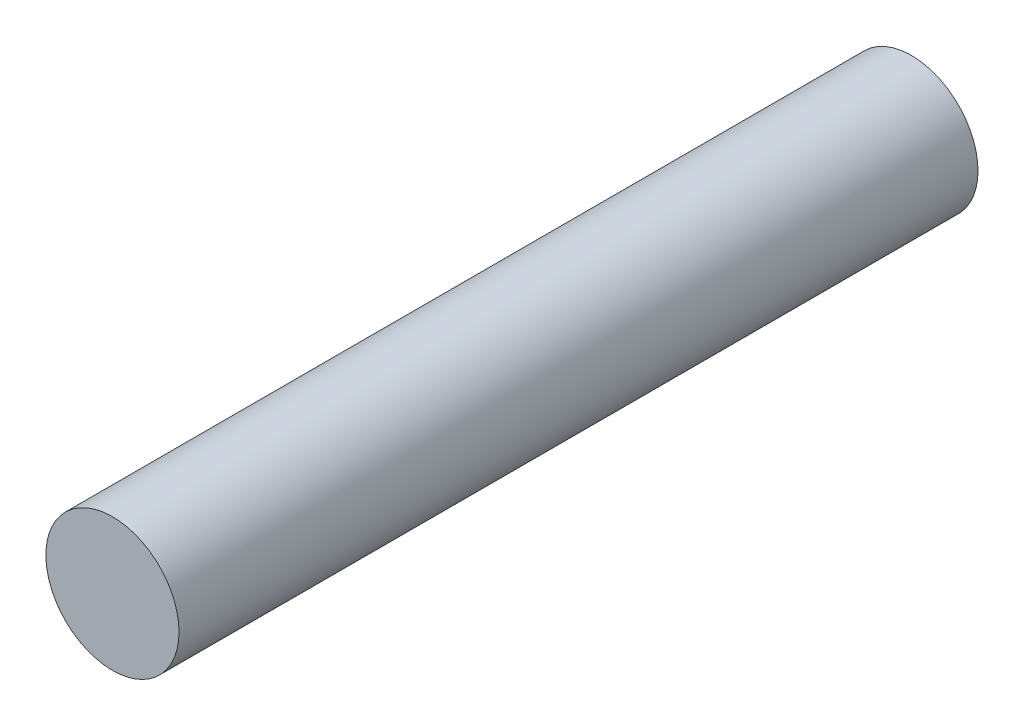
ISO-10303-21;
HEADER;
FILE_DESCRIPTION(('STEP AP214'),'2;1');
FILE_NAME('part.step','',(''),(''),'','','');
FILE_SCHEMA(('AUTOMOTIVE_DESIGN { 1 0 10303 214 1 1 1 1 }'));
ENDSEC;
DATA;
#1=APPLICATION_CONTEXT('core data for automotive mechanical design processes');
#2=APPLICATION_PROTOCOL_DEFINITION('international standard','automotive_design',2000,#1);
#3=PRODUCT_CONTEXT('',#1,'mechanical');
#4=PRODUCT('Part','Part','',(#3));
#5=PRODUCT_RELATED_PRODUCT_CATEGORY('part','',(#4));
#6=PRODUCT_DEFINITION_FORMATION('','',#4);
#7=PRODUCT_DEFINITION_CONTEXT('part definition',#1,'design');
#8=PRODUCT_DEFINITION('design','',#6,#7);
#9=PRODUCT_DEFINITION_SHAPE('','',#8);
#10=(LENGTH_UNIT() NAMED_UNIT(*) SI_UNIT(.MILLI.,.METRE.));
#11=(NAMED_UNIT(*) PLANE_ANGLE_UNIT() SI_UNIT($,.RADIAN.));
#12=(NAMED_UNIT(*) SI_UNIT($,.STERADIAN.) SOLID_ANGLE_UNIT());
#13=UNCERTAINTY_MEASURE_WITH_UNIT(LENGTH_MEASURE(1.E-05),#10,'distance_accuracy_value','');
#14=(GEOMETRIC_REPRESENTATION_CONTEXT(3) GLOBAL_UNCERTAINTY_ASSIGNED_CONTEXT((#13)) GLOBAL_UNIT_ASSIGNED_CONTEXT((#10,
#11,#12)) REPRESENTATION_CONTEXT('',''));
#15=CARTESIAN_POINT('',(0.,0.,0.));
#16=DIRECTION('',(0.,0.,1.));
#17=DIRECTION('',(1.,0.,0.));
#18=AXIS2_PLACEMENT_3D('',#15,#16,#17);
#19=CARTESIAN_POINT('',(0.,0.,15.));
#20=DIRECTION('',(0.,0.,-1.));
#21=DIRECTION('',(-1.,0.,0.));
#22=AXIS2_PLACEMENT_3D('',#19,#20,#21);
#23=CYLINDRICAL_SURFACE('',#22,2.5);
#24=CARTESIAN_POINT('',(0.,0.,15.));
#25=DIRECTION('',(0.,0.,1.));
#26=DIRECTION('',(1.,0.,0.));
#27=AXIS2_PLACEMENT_3D('',#24,#25,#26);
#28=CIRCLE('',#27,2.5);
#29=CARTESIAN_POINT('',(2.5,0.,15.));
#30=VERTEX_POINT('',#29);
#31=EDGE_CURVE('E10',#30,#30,#28,.T.);
#32=ORIENTED_EDGE('',*,*,#31,.F.);
#33=EDGE_LOOP('',(#32));
#34=FACE_BOUND('',#33,.T.);
#35=CARTESIAN_POINT('',(0.,0.,-15.));
#36=DIRECTION('',(0.,0.,1.));
#37=DIRECTION('',(1.,0.,0.));
#38=AXIS2_PLACEMENT_3D('',#35,#36,#37);
#39=CIRCLE('',#38,2.5);
#40=CARTESIAN_POINT('',(2.5,0.,-15.));
#41=VERTEX_POINT('',#40);
#42=EDGE_CURVE('E42',#41,#41,#39,.T.);
#43=ORIENTED_EDGE('',*,*,#42,.T.);
#44=EDGE_LOOP('',(#43));
#45=FACE_BOUND('',#44,.T.);
#46=ADVANCED_FACE('F39',(#34,#45),#23,.T.);
#47=CARTESIAN_POINT('',(0.,0.,15.));
#48=DIRECTION('',(0.,0.,1.));
#49=DIRECTION('',(1.,0.,0.));
#50=AXIS2_PLACEMENT_3D('',#47,#48,#49);
#51=PLANE('',#50);
#52=ORIENTED_EDGE('',*,*,#31,.T.);
#53=EDGE_LOOP('',(#52));
#54=FACE_BOUND('',#53,.T.);
#55=ADVANCED_FACE('F54',(#54),#51,.T.);
#56=CARTESIAN_POINT('',(0.,0.,-15.));
#57=DIRECTION('',(0.,0.,1.));
#58=DIRECTION('',(1.,0.,0.));
#59=AXIS2_PLACEMENT_3D('',#56,#57,#58);
#60=PLANE('',#59);
#61=ORIENTED_EDGE('',*,*,#42,.F.);
#62=EDGE_LOOP('',(#61));
#63=FACE_BOUND('',#62,.T.);
#64=ADVANCED_FACE('F52',(#63),#60,.F.);
#65=CLOSED_SHELL('',(#46,#55,#64));
#66=MANIFOLD_SOLID_BREP('B2',#65);
#67=ADVANCED_BREP_SHAPE_REPRESENTATION('',(#18,#66),#14);
#68=SHAPE_DEFINITION_REPRESENTATION(#9,#67);
ENDSEC;
END-ISO-10303-21;
